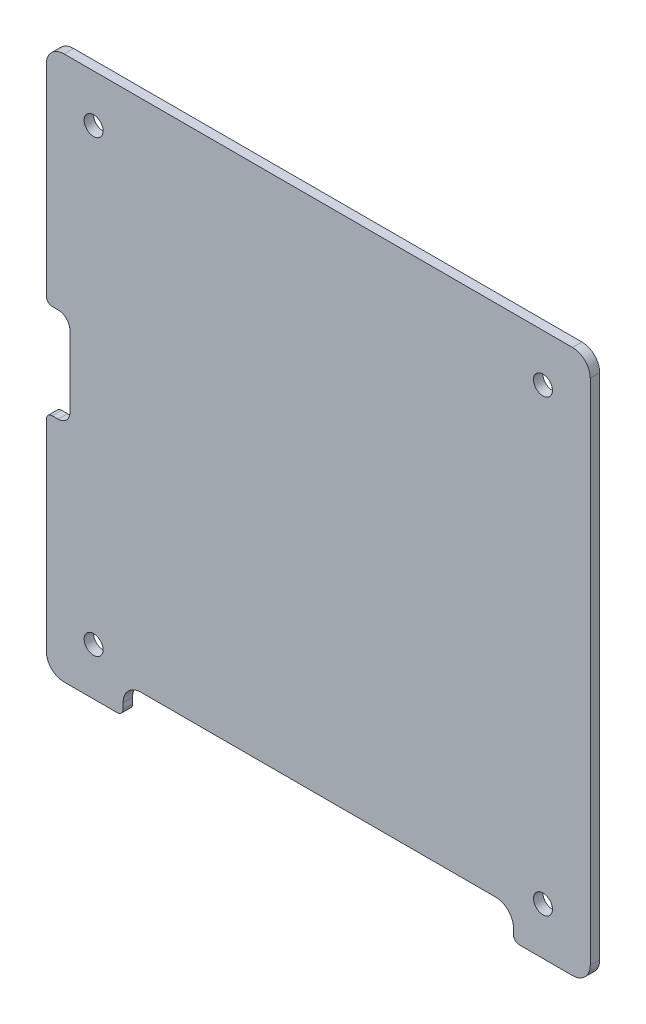
ISO-10303-21;
HEADER;
FILE_DESCRIPTION(('STEP AP214'),'2;1');
FILE_NAME('part.step','',(''),(''),'','','');
FILE_SCHEMA(('AUTOMOTIVE_DESIGN { 1 0 10303 214 1 1 1 1 }'));
ENDSEC;
DATA;
#1=APPLICATION_CONTEXT('core data for automotive mechanical design processes');
#2=APPLICATION_PROTOCOL_DEFINITION('international standard','automotive_design',2000,#1);
#3=PRODUCT_CONTEXT('',#1,'mechanical');
#4=PRODUCT('Part','Part','',(#3));
#5=PRODUCT_RELATED_PRODUCT_CATEGORY('part','',(#4));
#6=PRODUCT_DEFINITION_FORMATION('','',#4);
#7=PRODUCT_DEFINITION_CONTEXT('part definition',#1,'design');
#8=PRODUCT_DEFINITION('design','',#6,#7);
#9=PRODUCT_DEFINITION_SHAPE('','',#8);
#10=(LENGTH_UNIT() NAMED_UNIT(*) SI_UNIT(.MILLI.,.METRE.));
#11=(NAMED_UNIT(*) PLANE_ANGLE_UNIT() SI_UNIT($,.RADIAN.));
#12=(NAMED_UNIT(*) SI_UNIT($,.STERADIAN.) SOLID_ANGLE_UNIT());
#13=UNCERTAINTY_MEASURE_WITH_UNIT(LENGTH_MEASURE(1.E-05),#10,'distance_accuracy_value','');
#14=(GEOMETRIC_REPRESENTATION_CONTEXT(3) GLOBAL_UNCERTAINTY_ASSIGNED_CONTEXT((#13)) GLOBAL_UNIT_ASSIGNED_CONTEXT((#10,
#11,#12)) REPRESENTATION_CONTEXT('',''));
#15=CARTESIAN_POINT('',(0.,0.,0.));
#16=DIRECTION('',(0.,0.,1.));
#17=DIRECTION('',(1.,0.,0.));
#18=AXIS2_PLACEMENT_3D('',#15,#16,#17);
#19=CARTESIAN_POINT('',(6.50000000000001,92.75,-1.6));
#20=DIRECTION('',(1.,0.,0.));
#21=DIRECTION('',(0.,1.,0.));
#22=AXIS2_PLACEMENT_3D('',#19,#20,#21);
#23=PLANE('',#22);
#24=DIRECTION('',(0.,1.,0.));
#25=VECTOR('',#24,1.);
#26=CARTESIAN_POINT('',(6.50000000000001,92.75,0.));
#27=LINE('',#26,#25);
#28=CARTESIAN_POINT('',(6.49999999999999,3.75,0.));
#29=VERTEX_POINT('',#28);
#30=CARTESIAN_POINT('',(6.50000000000001,89.75,0.));
#31=VERTEX_POINT('',#30);
#32=EDGE_CURVE('E362',#29,#31,#27,.T.);
#33=ORIENTED_EDGE('',*,*,#32,.F.);
#34=DIRECTION('',(0.,0.,1.));
#35=VECTOR('',#34,1.);
#36=CARTESIAN_POINT('',(6.49999999999999,3.75,-1.6));
#37=LINE('',#36,#35);
#38=CARTESIAN_POINT('',(6.49999999999999,3.75,-1.6));
#39=VERTEX_POINT('',#38);
#40=EDGE_CURVE('E247',#29,#39,#37,.F.);
#41=ORIENTED_EDGE('',*,*,#40,.T.);
#42=DIRECTION('',(0.,1.,0.));
#43=VECTOR('',#42,1.);
#44=CARTESIAN_POINT('',(6.50000000000001,92.75,-1.6));
#45=LINE('',#44,#43);
#46=CARTESIAN_POINT('',(6.50000000000001,89.75,-1.6));
#47=VERTEX_POINT('',#46);
#48=EDGE_CURVE('E381',#39,#47,#45,.T.);
#49=ORIENTED_EDGE('',*,*,#48,.T.);
#50=DIRECTION('',(0.,0.,1.));
#51=VECTOR('',#50,1.);
#52=CARTESIAN_POINT('',(6.50000000000001,89.75,-1.6));
#53=LINE('',#52,#51);
#54=EDGE_CURVE('E244',#47,#31,#53,.T.);
#55=ORIENTED_EDGE('',*,*,#54,.T.);
#56=EDGE_LOOP('',(#33,#41,#49,#55));
#57=FACE_BOUND('',#56,.T.);
#58=ADVANCED_FACE('F32',(#57),#23,.T.);
#59=CARTESIAN_POINT('',(6.49999999999999,0.750000000000002,-1.6));
#60=DIRECTION('',(0.,-1.,0.));
#61=DIRECTION('',(1.,0.,0.));
#62=AXIS2_PLACEMENT_3D('',#59,#60,#61);
#63=PLANE('',#62);
#64=DIRECTION('',(1.,0.,0.));
#65=VECTOR('',#64,1.);
#66=CARTESIAN_POINT('',(6.49999999999999,0.750000000000002,0.));
#67=LINE('',#66,#65);
#68=CARTESIAN_POINT('',(-5.50000000000001,0.750000000000011,0.));
#69=VERTEX_POINT('',#68);
#70=CARTESIAN_POINT('',(3.49999999999999,0.750000000000005,0.));
#71=VERTEX_POINT('',#70);
#72=EDGE_CURVE('E227',#69,#71,#67,.T.);
#73=ORIENTED_EDGE('',*,*,#72,.F.);
#74=DIRECTION('',(0.,0.,1.));
#75=VECTOR('',#74,1.);
#76=CARTESIAN_POINT('',(-5.50000000000001,0.750000000000011,-1.6));
#77=LINE('',#76,#75);
#78=CARTESIAN_POINT('',(-5.50000000000001,0.750000000000011,-1.6));
#79=VERTEX_POINT('',#78);
#80=EDGE_CURVE('E305',#69,#79,#77,.F.);
#81=ORIENTED_EDGE('',*,*,#80,.T.);
#82=DIRECTION('',(1.,0.,0.));
#83=VECTOR('',#82,1.);
#84=CARTESIAN_POINT('',(6.49999999999999,0.750000000000002,-1.6));
#85=LINE('',#84,#83);
#86=CARTESIAN_POINT('',(3.49999999999999,0.750000000000005,-1.6));
#87=VERTEX_POINT('',#86);
#88=EDGE_CURVE('E220',#79,#87,#85,.T.);
#89=ORIENTED_EDGE('',*,*,#88,.T.);
#90=DIRECTION('',(0.,0.,1.));
#91=VECTOR('',#90,1.);
#92=CARTESIAN_POINT('',(3.49999999999999,0.750000000000005,-1.6));
#93=LINE('',#92,#91);
#94=EDGE_CURVE('E233',#87,#71,#93,.T.);
#95=ORIENTED_EDGE('',*,*,#94,.T.);
#96=EDGE_LOOP('',(#73,#81,#89,#95));
#97=FACE_BOUND('',#96,.T.);
#98=ADVANCED_FACE('F476',(#97),#63,.T.);
#99=CARTESIAN_POINT('',(-6.49999999999999,5.75,-1.6));
#100=DIRECTION('',(-1.,0.,0.));
#101=DIRECTION('',(0.,-1.,0.));
#102=AXIS2_PLACEMENT_3D('',#99,#100,#101);
#103=PLANE('',#102);
#104=DIRECTION('',(0.,-1.,0.));
#105=VECTOR('',#104,1.);
#106=CARTESIAN_POINT('',(-6.49999999999999,5.75,-1.6));
#107=LINE('',#106,#105);
#108=CARTESIAN_POINT('',(-6.50000000000001,2.74999999999998,-1.6));
#109=VERTEX_POINT('',#108);
#110=CARTESIAN_POINT('',(-6.50000000000001,1.75000000000002,-1.6));
#111=VERTEX_POINT('',#110);
#112=EDGE_CURVE('E224',#109,#111,#107,.T.);
#113=ORIENTED_EDGE('',*,*,#112,.T.);
#114=DIRECTION('',(0.,0.,1.));
#115=VECTOR('',#114,1.);
#116=CARTESIAN_POINT('',(-6.50000000000001,1.75000000000002,-1.6));
#117=LINE('',#116,#115);
#118=CARTESIAN_POINT('',(-6.50000000000001,1.75000000000002,0.));
#119=VERTEX_POINT('',#118);
#120=EDGE_CURVE('E302',#111,#119,#117,.T.);
#121=ORIENTED_EDGE('',*,*,#120,.T.);
#122=DIRECTION('',(0.,-1.,0.));
#123=VECTOR('',#122,1.);
#124=CARTESIAN_POINT('',(-6.49999999999999,5.75,0.));
#125=LINE('',#124,#123);
#126=CARTESIAN_POINT('',(-6.50000000000001,2.74999999999998,0.));
#127=VERTEX_POINT('',#126);
#128=EDGE_CURVE('E215',#127,#119,#125,.T.);
#129=ORIENTED_EDGE('',*,*,#128,.F.);
#130=DIRECTION('',(0.,0.,1.));
#131=VECTOR('',#130,1.);
#132=CARTESIAN_POINT('',(-6.50000000000001,2.74999999999998,-1.6));
#133=LINE('',#132,#131);
#134=EDGE_CURVE('E222',#127,#109,#133,.F.);
#135=ORIENTED_EDGE('',*,*,#134,.T.);
#136=EDGE_LOOP('',(#113,#121,#129,#135));
#137=FACE_BOUND('',#136,.T.);
#138=ADVANCED_FACE('F469',(#137),#103,.T.);
#139=CARTESIAN_POINT('',(-72.5,5.75,-1.6));
#140=DIRECTION('',(0.,-1.,0.));
#141=DIRECTION('',(0.,0.,-1.));
#142=AXIS2_PLACEMENT_3D('',#139,#140,#141);
#143=PLANE('',#142);
#144=DIRECTION('',(1.,0.,0.));
#145=VECTOR('',#144,1.);
#146=CARTESIAN_POINT('',(-72.5,5.75,-1.6));
#147=LINE('',#146,#145);
#148=CARTESIAN_POINT('',(-69.5,5.75,-1.6));
#149=VERTEX_POINT('',#148);
#150=CARTESIAN_POINT('',(-9.50000000000001,5.75,-1.6));
#151=VERTEX_POINT('',#150);
#152=EDGE_CURVE('E358',#149,#151,#147,.T.);
#153=ORIENTED_EDGE('',*,*,#152,.T.);
#154=DIRECTION('',(0.,0.,1.));
#155=VECTOR('',#154,1.);
#156=CARTESIAN_POINT('',(-9.50000000000001,5.75,0.));
#157=LINE('',#156,#155);
#158=CARTESIAN_POINT('',(-9.50000000000001,5.75,0.));
#159=VERTEX_POINT('',#158);
#160=EDGE_CURVE('E214',#151,#159,#157,.T.);
#161=ORIENTED_EDGE('',*,*,#160,.T.);
#162=DIRECTION('',(1.,0.,0.));
#163=VECTOR('',#162,1.);
#164=CARTESIAN_POINT('',(-72.5,5.75,0.));
#165=LINE('',#164,#163);
#166=CARTESIAN_POINT('',(-69.5,5.75,0.));
#167=VERTEX_POINT('',#166);
#168=EDGE_CURVE('E197',#167,#159,#165,.T.);
#169=ORIENTED_EDGE('',*,*,#168,.F.);
#170=DIRECTION('',(0.,0.,1.));
#171=VECTOR('',#170,1.);
#172=CARTESIAN_POINT('',(-69.5,5.75,-1.6));
#173=LINE('',#172,#171);
#174=EDGE_CURVE('E211',#167,#149,#173,.F.);
#175=ORIENTED_EDGE('',*,*,#174,.T.);
#176=EDGE_LOOP('',(#153,#161,#169,#175));
#177=FACE_BOUND('',#176,.T.);
#178=ADVANCED_FACE('F210',(#177),#143,.T.);
#179=CARTESIAN_POINT('',(-72.5,0.750000000000004,-1.6));
#180=DIRECTION('',(1.,0.,0.));
#181=DIRECTION('',(0.,0.,-1.));
#182=AXIS2_PLACEMENT_3D('',#179,#180,#181);
#183=PLANE('',#182);
#184=DIRECTION('',(0.,1.,0.));
#185=VECTOR('',#184,1.);
#186=CARTESIAN_POINT('',(-72.5,0.750000000000004,0.));
#187=LINE('',#186,#185);
#188=CARTESIAN_POINT('',(-72.5,1.75,0.));
#189=VERTEX_POINT('',#188);
#190=CARTESIAN_POINT('',(-72.5,2.75,0.));
#191=VERTEX_POINT('',#190);
#192=EDGE_CURVE('E199',#189,#191,#187,.T.);
#193=ORIENTED_EDGE('',*,*,#192,.F.);
#194=DIRECTION('',(0.,0.,1.));
#195=VECTOR('',#194,1.);
#196=CARTESIAN_POINT('',(-72.5,1.75,-1.6));
#197=LINE('',#196,#195);
#198=CARTESIAN_POINT('',(-72.5,1.75,-1.6));
#199=VERTEX_POINT('',#198);
#200=EDGE_CURVE('E310',#189,#199,#197,.F.);
#201=ORIENTED_EDGE('',*,*,#200,.T.);
#202=DIRECTION('',(0.,1.,0.));
#203=VECTOR('',#202,1.);
#204=CARTESIAN_POINT('',(-72.5,0.750000000000004,-1.6));
#205=LINE('',#204,#203);
#206=CARTESIAN_POINT('',(-72.5,2.75,-1.6));
#207=VERTEX_POINT('',#206);
#208=EDGE_CURVE('E356',#199,#207,#205,.T.);
#209=ORIENTED_EDGE('',*,*,#208,.T.);
#210=DIRECTION('',(0.,0.,1.));
#211=VECTOR('',#210,1.);
#212=CARTESIAN_POINT('',(-72.5,2.75,0.));
#213=LINE('',#212,#211);
#214=EDGE_CURVE('E231',#207,#191,#213,.T.);
#215=ORIENTED_EDGE('',*,*,#214,.T.);
#216=EDGE_LOOP('',(#193,#201,#209,#215));
#217=FACE_BOUND('',#216,.T.);
#218=ADVANCED_FACE('F461',(#217),#183,.T.);
#219=CARTESIAN_POINT('',(-72.5,0.750000000000004,-1.6));
#220=DIRECTION('',(0.,-1.,0.));
#221=DIRECTION('',(1.,0.,0.));
#222=AXIS2_PLACEMENT_3D('',#219,#220,#221);
#223=PLANE('',#222);
#224=DIRECTION('',(1.,0.,0.));
#225=VECTOR('',#224,1.);
#226=CARTESIAN_POINT('',(-72.5,0.750000000000004,-1.6));
#227=LINE('',#226,#225);
#228=CARTESIAN_POINT('',(-82.5,0.750000000000003,-1.6));
#229=VERTEX_POINT('',#228);
#230=CARTESIAN_POINT('',(-73.5,0.750000000000004,-1.6));
#231=VERTEX_POINT('',#230);
#232=EDGE_CURVE('E353',#229,#231,#227,.T.);
#233=ORIENTED_EDGE('',*,*,#232,.T.);
#234=DIRECTION('',(0.,0.,1.));
#235=VECTOR('',#234,1.);
#236=CARTESIAN_POINT('',(-73.5,0.750000000000004,-1.6));
#237=LINE('',#236,#235);
#238=CARTESIAN_POINT('',(-73.5,0.750000000000004,0.));
#239=VERTEX_POINT('',#238);
#240=EDGE_CURVE('E307',#231,#239,#237,.T.);
#241=ORIENTED_EDGE('',*,*,#240,.T.);
#242=DIRECTION('',(1.,0.,0.));
#243=VECTOR('',#242,1.);
#244=CARTESIAN_POINT('',(-72.5,0.750000000000004,0.));
#245=LINE('',#244,#243);
#246=CARTESIAN_POINT('',(-82.5,0.750000000000003,0.));
#247=VERTEX_POINT('',#246);
#248=EDGE_CURVE('E376',#247,#239,#245,.T.);
#249=ORIENTED_EDGE('',*,*,#248,.F.);
#250=DIRECTION('',(0.,0.,1.));
#251=VECTOR('',#250,1.);
#252=CARTESIAN_POINT('',(-82.5,0.750000000000003,-1.6));
#253=LINE('',#252,#251);
#254=EDGE_CURVE('E262',#247,#229,#253,.F.);
#255=ORIENTED_EDGE('',*,*,#254,.T.);
#256=EDGE_LOOP('',(#233,#241,#249,#255));
#257=FACE_BOUND('',#256,.T.);
#258=ADVANCED_FACE('F454',(#257),#223,.T.);
#259=CARTESIAN_POINT('',(-85.5,38.75,-1.6));
#260=DIRECTION('',(-1.,0.,0.));
#261=DIRECTION('',(0.,0.,1.));
#262=AXIS2_PLACEMENT_3D('',#259,#260,#261);
#263=PLANE('',#262);
#264=DIRECTION('',(0.,-1.,0.));
#265=VECTOR('',#264,1.);
#266=CARTESIAN_POINT('',(-85.5,38.75,0.));
#267=LINE('',#266,#265);
#268=CARTESIAN_POINT('',(-85.5,37.75,0.));
#269=VERTEX_POINT('',#268);
#270=CARTESIAN_POINT('',(-85.5,3.75,0.));
#271=VERTEX_POINT('',#270);
#272=EDGE_CURVE('E374',#269,#271,#267,.T.);
#273=ORIENTED_EDGE('',*,*,#272,.F.);
#274=DIRECTION('',(0.,0.,1.));
#275=VECTOR('',#274,1.);
#276=CARTESIAN_POINT('',(-85.5,37.75,-1.6));
#277=LINE('',#276,#275);
#278=CARTESIAN_POINT('',(-85.5,37.75,-1.6));
#279=VERTEX_POINT('',#278);
#280=EDGE_CURVE('E286',#269,#279,#277,.F.);
#281=ORIENTED_EDGE('',*,*,#280,.T.);
#282=DIRECTION('',(0.,-1.,0.));
#283=VECTOR('',#282,1.);
#284=CARTESIAN_POINT('',(-85.5,38.75,-1.6));
#285=LINE('',#284,#283);
#286=CARTESIAN_POINT('',(-85.5,3.75,-1.6));
#287=VERTEX_POINT('',#286);
#288=EDGE_CURVE('E351',#279,#287,#285,.T.);
#289=ORIENTED_EDGE('',*,*,#288,.T.);
#290=DIRECTION('',(0.,0.,1.));
#291=VECTOR('',#290,1.);
#292=CARTESIAN_POINT('',(-85.5,3.75,-1.6));
#293=LINE('',#292,#291);
#294=EDGE_CURVE('E259',#287,#271,#293,.T.);
#295=ORIENTED_EDGE('',*,*,#294,.T.);
#296=EDGE_LOOP('',(#273,#281,#289,#295));
#297=FACE_BOUND('',#296,.T.);
#298=ADVANCED_FACE('F448',(#297),#263,.T.);
#299=CARTESIAN_POINT('',(-81.5,38.75,-1.6));
#300=DIRECTION('',(0.,1.,0.));
#301=DIRECTION('',(0.,0.,1.));
#302=AXIS2_PLACEMENT_3D('',#299,#300,#301);
#303=PLANE('',#302);
#304=DIRECTION('',(-1.,0.,0.));
#305=VECTOR('',#304,1.);
#306=CARTESIAN_POINT('',(-81.5,38.75,0.));
#307=LINE('',#306,#305);
#308=CARTESIAN_POINT('',(-83.5,38.75,0.));
#309=VERTEX_POINT('',#308);
#310=CARTESIAN_POINT('',(-84.5,38.75,0.));
#311=VERTEX_POINT('',#310);
#312=EDGE_CURVE('E333',#309,#311,#307,.T.);
#313=ORIENTED_EDGE('',*,*,#312,.F.);
#314=DIRECTION('',(0.,0.,1.));
#315=VECTOR('',#314,1.);
#316=CARTESIAN_POINT('',(-83.5,38.75,-1.6));
#317=LINE('',#316,#315);
#318=CARTESIAN_POINT('',(-83.5,38.75,-1.6));
#319=VERTEX_POINT('',#318);
#320=EDGE_CURVE('E317',#309,#319,#317,.F.);
#321=ORIENTED_EDGE('',*,*,#320,.T.);
#322=DIRECTION('',(-1.,0.,0.));
#323=VECTOR('',#322,1.);
#324=CARTESIAN_POINT('',(-81.5,38.75,-1.6));
#325=LINE('',#324,#323);
#326=CARTESIAN_POINT('',(-84.5,38.75,-1.6));
#327=VERTEX_POINT('',#326);
#328=EDGE_CURVE('E343',#319,#327,#325,.T.);
#329=ORIENTED_EDGE('',*,*,#328,.T.);
#330=DIRECTION('',(0.,0.,1.));
#331=VECTOR('',#330,1.);
#332=CARTESIAN_POINT('',(-84.5,38.75,-1.6));
#333=LINE('',#332,#331);
#334=EDGE_CURVE('E275',#327,#311,#333,.T.);
#335=ORIENTED_EDGE('',*,*,#334,.T.);
#336=EDGE_LOOP('',(#313,#321,#329,#335));
#337=FACE_BOUND('',#336,.T.);
#338=ADVANCED_FACE('F441',(#337),#303,.T.);
#339=CARTESIAN_POINT('',(-81.5,54.75,-1.6));
#340=DIRECTION('',(-1.,0.,0.));
#341=DIRECTION('',(0.,-1.,0.));
#342=AXIS2_PLACEMENT_3D('',#339,#340,#341);
#343=PLANE('',#342);
#344=DIRECTION('',(0.,-1.,0.));
#345=VECTOR('',#344,1.);
#346=CARTESIAN_POINT('',(-81.5,54.75,-1.6));
#347=LINE('',#346,#345);
#348=CARTESIAN_POINT('',(-81.5,52.75,-1.6));
#349=VERTEX_POINT('',#348);
#350=CARTESIAN_POINT('',(-81.5,40.75,-1.6));
#351=VERTEX_POINT('',#350);
#352=EDGE_CURVE('E340',#349,#351,#347,.T.);
#353=ORIENTED_EDGE('',*,*,#352,.T.);
#354=DIRECTION('',(0.,0.,1.));
#355=VECTOR('',#354,1.);
#356=CARTESIAN_POINT('',(-81.5,40.75,0.));
#357=LINE('',#356,#355);
#358=CARTESIAN_POINT('',(-81.5,40.75,0.));
#359=VERTEX_POINT('',#358);
#360=EDGE_CURVE('E314',#351,#359,#357,.T.);
#361=ORIENTED_EDGE('',*,*,#360,.T.);
#362=DIRECTION('',(0.,-1.,0.));
#363=VECTOR('',#362,1.);
#364=CARTESIAN_POINT('',(-81.5,54.75,0.));
#365=LINE('',#364,#363);
#366=CARTESIAN_POINT('',(-81.5,52.75,0.));
#367=VERTEX_POINT('',#366);
#368=EDGE_CURVE('E326',#367,#359,#365,.T.);
#369=ORIENTED_EDGE('',*,*,#368,.F.);
#370=DIRECTION('',(0.,0.,1.));
#371=VECTOR('',#370,1.);
#372=CARTESIAN_POINT('',(-81.5,52.75,-1.6));
#373=LINE('',#372,#371);
#374=EDGE_CURVE('E312',#367,#349,#373,.F.);
#375=ORIENTED_EDGE('',*,*,#374,.T.);
#376=EDGE_LOOP('',(#353,#361,#369,#375));
#377=FACE_BOUND('',#376,.T.);
#378=ADVANCED_FACE('F331',(#377),#343,.T.);
#379=CARTESIAN_POINT('',(-85.5,54.75,-1.6));
#380=DIRECTION('',(0.,-1.,0.));
#381=DIRECTION('',(0.,0.,-1.));
#382=AXIS2_PLACEMENT_3D('',#379,#380,#381);
#383=PLANE('',#382);
#384=DIRECTION('',(1.,0.,0.));
#385=VECTOR('',#384,1.);
#386=CARTESIAN_POINT('',(-85.5,54.75,-1.6));
#387=LINE('',#386,#385);
#388=CARTESIAN_POINT('',(-84.5,54.75,-1.6));
#389=VERTEX_POINT('',#388);
#390=CARTESIAN_POINT('',(-83.5,54.75,-1.6));
#391=VERTEX_POINT('',#390);
#392=EDGE_CURVE('E338',#389,#391,#387,.T.);
#393=ORIENTED_EDGE('',*,*,#392,.T.);
#394=DIRECTION('',(0.,0.,1.));
#395=VECTOR('',#394,1.);
#396=CARTESIAN_POINT('',(-83.5,54.75,0.));
#397=LINE('',#396,#395);
#398=CARTESIAN_POINT('',(-83.5,54.75,0.));
#399=VERTEX_POINT('',#398);
#400=EDGE_CURVE('E319',#391,#399,#397,.T.);
#401=ORIENTED_EDGE('',*,*,#400,.T.);
#402=DIRECTION('',(1.,0.,0.));
#403=VECTOR('',#402,1.);
#404=CARTESIAN_POINT('',(-85.5,54.75,0.));
#405=LINE('',#404,#403);
#406=CARTESIAN_POINT('',(-84.5,54.75,0.));
#407=VERTEX_POINT('',#406);
#408=EDGE_CURVE('E328',#407,#399,#405,.T.);
#409=ORIENTED_EDGE('',*,*,#408,.F.);
#410=DIRECTION('',(0.,0.,1.));
#411=VECTOR('',#410,1.);
#412=CARTESIAN_POINT('',(-84.5,54.75,-1.6));
#413=LINE('',#412,#411);
#414=EDGE_CURVE('E300',#407,#389,#413,.F.);
#415=ORIENTED_EDGE('',*,*,#414,.T.);
#416=EDGE_LOOP('',(#393,#401,#409,#415));
#417=FACE_BOUND('',#416,.T.);
#418=ADVANCED_FACE('F336',(#417),#383,.T.);
#419=CARTESIAN_POINT('',(-85.5,92.75,-1.6));
#420=DIRECTION('',(-1.,0.,0.));
#421=DIRECTION('',(0.,0.,1.));
#422=AXIS2_PLACEMENT_3D('',#419,#420,#421);
#423=PLANE('',#422);
#424=DIRECTION('',(0.,-1.,0.));
#425=VECTOR('',#424,1.);
#426=CARTESIAN_POINT('',(-85.5,92.75,-1.6));
#427=LINE('',#426,#425);
#428=CARTESIAN_POINT('',(-85.5,89.75,-1.6));
#429=VERTEX_POINT('',#428);
#430=CARTESIAN_POINT('',(-85.5,55.75,-1.6));
#431=VERTEX_POINT('',#430);
#432=EDGE_CURVE('E341',#429,#431,#427,.T.);
#433=ORIENTED_EDGE('',*,*,#432,.T.);
#434=DIRECTION('',(0.,0.,1.));
#435=VECTOR('',#434,1.);
#436=CARTESIAN_POINT('',(-85.5,55.75,-1.6));
#437=LINE('',#436,#435);
#438=CARTESIAN_POINT('',(-85.5,55.75,0.));
#439=VERTEX_POINT('',#438);
#440=EDGE_CURVE('E297',#431,#439,#437,.T.);
#441=ORIENTED_EDGE('',*,*,#440,.T.);
#442=DIRECTION('',(0.,-1.,0.));
#443=VECTOR('',#442,1.);
#444=CARTESIAN_POINT('',(-85.5,92.75,0.));
#445=LINE('',#444,#443);
#446=CARTESIAN_POINT('',(-85.5,89.75,0.));
#447=VERTEX_POINT('',#446);
#448=EDGE_CURVE('E369',#447,#439,#445,.T.);
#449=ORIENTED_EDGE('',*,*,#448,.F.);
#450=DIRECTION('',(0.,0.,1.));
#451=VECTOR('',#450,1.);
#452=CARTESIAN_POINT('',(-85.5,89.75,-1.6));
#453=LINE('',#452,#451);
#454=EDGE_CURVE('E269',#447,#429,#453,.F.);
#455=ORIENTED_EDGE('',*,*,#454,.T.);
#456=EDGE_LOOP('',(#433,#441,#449,#455));
#457=FACE_BOUND('',#456,.T.);
#458=ADVANCED_FACE('F498',(#457),#423,.T.);
#459=CARTESIAN_POINT('',(6.50000000000001,92.75,-1.6));
#460=DIRECTION('',(0.,1.,0.));
#461=DIRECTION('',(0.,0.,1.));
#462=AXIS2_PLACEMENT_3D('',#459,#460,#461);
#463=PLANE('',#462);
#464=DIRECTION('',(-1.,0.,0.));
#465=VECTOR('',#464,1.);
#466=CARTESIAN_POINT('',(6.50000000000001,92.75,-1.6));
#467=LINE('',#466,#465);
#468=CARTESIAN_POINT('',(3.50000000000001,92.75,-1.6));
#469=VERTEX_POINT('',#468);
#470=CARTESIAN_POINT('',(-82.5,92.75,-1.6));
#471=VERTEX_POINT('',#470);
#472=EDGE_CURVE('E346',#469,#471,#467,.T.);
#473=ORIENTED_EDGE('',*,*,#472,.T.);
#474=DIRECTION('',(0.,0.,1.));
#475=VECTOR('',#474,1.);
#476=CARTESIAN_POINT('',(-82.5,92.75,-1.6));
#477=LINE('',#476,#475);
#478=CARTESIAN_POINT('',(-82.5,92.75,0.));
#479=VERTEX_POINT('',#478);
#480=EDGE_CURVE('E266',#471,#479,#477,.T.);
#481=ORIENTED_EDGE('',*,*,#480,.T.);
#482=DIRECTION('',(-1.,0.,0.));
#483=VECTOR('',#482,1.);
#484=CARTESIAN_POINT('',(6.50000000000001,92.75,0.));
#485=LINE('',#484,#483);
#486=CARTESIAN_POINT('',(3.50000000000001,92.75,0.));
#487=VERTEX_POINT('',#486);
#488=EDGE_CURVE('E365',#487,#479,#485,.T.);
#489=ORIENTED_EDGE('',*,*,#488,.F.);
#490=DIRECTION('',(0.,0.,1.));
#491=VECTOR('',#490,1.);
#492=CARTESIAN_POINT('',(3.50000000000001,92.75,-1.6));
#493=LINE('',#492,#491);
#494=EDGE_CURVE('E264',#487,#469,#493,.F.);
#495=ORIENTED_EDGE('',*,*,#494,.T.);
#496=EDGE_LOOP('',(#473,#481,#489,#495));
#497=FACE_BOUND('',#496,.T.);
#498=ADVANCED_FACE('F420',(#497),#463,.T.);
#499=CARTESIAN_POINT('',(6.49999999999999,0.750000000000002,-1.6));
#500=DIRECTION('',(0.,0.,-1.));
#501=DIRECTION('',(-1.,0.,0.));
#502=AXIS2_PLACEMENT_3D('',#499,#500,#501);
#503=PLANE('',#502);
#504=CARTESIAN_POINT('',(-1.49999999999996,84.75,-1.6));
#505=DIRECTION('',(0.,0.,-1.));
#506=DIRECTION('',(-1.,0.,0.));
#507=AXIS2_PLACEMENT_3D('',#504,#505,#506);
#508=CIRCLE('',#507,1.59999999999999);
#509=CARTESIAN_POINT('',(-3.09999999999995,84.75,-1.6));
#510=VERTEX_POINT('',#509);
#511=EDGE_CURVE('E411',#510,#510,#508,.T.);
#512=ORIENTED_EDGE('',*,*,#511,.F.);
#513=EDGE_LOOP('',(#512));
#514=FACE_BOUND('',#513,.T.);
#515=CARTESIAN_POINT('',(-1.49999999999998,8.74999999999998,-1.6));
#516=DIRECTION('',(0.,0.,-1.));
#517=DIRECTION('',(-1.,0.,0.));
#518=AXIS2_PLACEMENT_3D('',#515,#516,#517);
#519=CIRCLE('',#518,1.59999999999999);
#520=CARTESIAN_POINT('',(-3.09999999999997,8.74999999999998,-1.6));
#521=VERTEX_POINT('',#520);
#522=EDGE_CURVE('E405',#521,#521,#519,.T.);
#523=ORIENTED_EDGE('',*,*,#522,.F.);
#524=EDGE_LOOP('',(#523));
#525=FACE_BOUND('',#524,.T.);
#526=CARTESIAN_POINT('',(-77.5,8.75000000000002,-1.6));
#527=DIRECTION('',(0.,0.,-1.));
#528=DIRECTION('',(-1.,0.,0.));
#529=AXIS2_PLACEMENT_3D('',#526,#527,#528);
#530=CIRCLE('',#529,1.59999999999999);
#531=CARTESIAN_POINT('',(-79.1,8.75000000000002,-1.6));
#532=VERTEX_POINT('',#531);
#533=EDGE_CURVE('E399',#532,#532,#530,.T.);
#534=ORIENTED_EDGE('',*,*,#533,.F.);
#535=EDGE_LOOP('',(#534));
#536=FACE_BOUND('',#535,.T.);
#537=CARTESIAN_POINT('',(-77.5,84.7500000000001,-1.6));
#538=DIRECTION('',(0.,0.,-1.));
#539=DIRECTION('',(-1.,0.,0.));
#540=AXIS2_PLACEMENT_3D('',#537,#538,#539);
#541=CIRCLE('',#540,1.59999999999999);
#542=CARTESIAN_POINT('',(-79.1,84.7500000000001,-1.6));
#543=VERTEX_POINT('',#542);
#544=EDGE_CURVE('E393',#543,#543,#541,.T.);
#545=ORIENTED_EDGE('',*,*,#544,.F.);
#546=EDGE_LOOP('',(#545));
#547=FACE_BOUND('',#546,.T.);
#548=ORIENTED_EDGE('',*,*,#288,.F.);
#549=CARTESIAN_POINT('',(-84.5,37.75,-1.6));
#550=DIRECTION('',(0.,0.,-1.));
#551=DIRECTION('',(-1.,0.,0.));
#552=AXIS2_PLACEMENT_3D('',#549,#550,#551);
#553=CIRCLE('',#552,1.);
#554=EDGE_CURVE('E294',#279,#327,#553,.T.);
#555=ORIENTED_EDGE('',*,*,#554,.T.);
#556=ORIENTED_EDGE('',*,*,#328,.F.);
#557=CARTESIAN_POINT('',(-83.5,40.75,-1.6));
#558=DIRECTION('',(0.,0.,-1.));
#559=DIRECTION('',(-1.,0.,0.));
#560=AXIS2_PLACEMENT_3D('',#557,#558,#559);
#561=CIRCLE('',#560,2.);
#562=EDGE_CURVE('E323',#319,#351,#561,.F.);
#563=ORIENTED_EDGE('',*,*,#562,.T.);
#564=ORIENTED_EDGE('',*,*,#352,.F.);
#565=CARTESIAN_POINT('',(-83.5,52.75,-1.6));
#566=DIRECTION('',(0.,0.,-1.));
#567=DIRECTION('',(-1.,0.,0.));
#568=AXIS2_PLACEMENT_3D('',#565,#566,#567);
#569=CIRCLE('',#568,2.);
#570=EDGE_CURVE('E11',#349,#391,#569,.F.);
#571=ORIENTED_EDGE('',*,*,#570,.T.);
#572=ORIENTED_EDGE('',*,*,#392,.F.);
#573=CARTESIAN_POINT('',(-84.5,55.75,-1.6));
#574=DIRECTION('',(0.,0.,-1.));
#575=DIRECTION('',(-1.,0.,0.));
#576=AXIS2_PLACEMENT_3D('',#573,#574,#575);
#577=CIRCLE('',#576,1.);
#578=EDGE_CURVE('E292',#389,#431,#577,.T.);
#579=ORIENTED_EDGE('',*,*,#578,.T.);
#580=ORIENTED_EDGE('',*,*,#432,.F.);
#581=CARTESIAN_POINT('',(-82.5,89.75,-1.6));
#582=DIRECTION('',(0.,0.,-1.));
#583=DIRECTION('',(-1.,0.,0.));
#584=AXIS2_PLACEMENT_3D('',#581,#582,#583);
#585=CIRCLE('',#584,3.);
#586=EDGE_CURVE('E251',#429,#471,#585,.T.);
#587=ORIENTED_EDGE('',*,*,#586,.T.);
#588=ORIENTED_EDGE('',*,*,#472,.F.);
#589=CARTESIAN_POINT('',(3.50000000000001,89.75,-1.6));
#590=DIRECTION('',(0.,0.,-1.));
#591=DIRECTION('',(-1.,0.,0.));
#592=AXIS2_PLACEMENT_3D('',#589,#590,#591);
#593=CIRCLE('',#592,3.);
#594=EDGE_CURVE('E249',#469,#47,#593,.T.);
#595=ORIENTED_EDGE('',*,*,#594,.T.);
#596=ORIENTED_EDGE('',*,*,#48,.F.);
#597=CARTESIAN_POINT('',(3.49999999999999,3.75,-1.6));
#598=DIRECTION('',(0.,0.,-1.));
#599=DIRECTION('',(-1.,0.,0.));
#600=AXIS2_PLACEMENT_3D('',#597,#598,#599);
#601=CIRCLE('',#600,3.);
#602=EDGE_CURVE('E256',#39,#87,#601,.T.);
#603=ORIENTED_EDGE('',*,*,#602,.T.);
#604=ORIENTED_EDGE('',*,*,#88,.F.);
#605=CARTESIAN_POINT('',(-5.50000000000001,1.75000000000001,-1.6));
#606=DIRECTION('',(0.,0.,-1.));
#607=DIRECTION('',(-1.,0.,0.));
#608=AXIS2_PLACEMENT_3D('',#605,#606,#607);
#609=CIRCLE('',#608,1.);
#610=EDGE_CURVE('E290',#79,#111,#609,.T.);
#611=ORIENTED_EDGE('',*,*,#610,.T.);
#612=ORIENTED_EDGE('',*,*,#112,.F.);
#613=CARTESIAN_POINT('',(-9.50000000000001,2.75,-1.6));
#614=DIRECTION('',(0.,0.,-1.));
#615=DIRECTION('',(-1.,0.,0.));
#616=AXIS2_PLACEMENT_3D('',#613,#614,#615);
#617=CIRCLE('',#616,3.);
#618=EDGE_CURVE('E205',#109,#151,#617,.F.);
#619=ORIENTED_EDGE('',*,*,#618,.T.);
#620=ORIENTED_EDGE('',*,*,#152,.F.);
#621=CARTESIAN_POINT('',(-69.5,2.75,-1.6));
#622=DIRECTION('',(0.,0.,-1.));
#623=DIRECTION('',(-1.,0.,0.));
#624=AXIS2_PLACEMENT_3D('',#621,#622,#623);
#625=CIRCLE('',#624,3.);
#626=EDGE_CURVE('E204',#149,#207,#625,.F.);
#627=ORIENTED_EDGE('',*,*,#626,.T.);
#628=ORIENTED_EDGE('',*,*,#208,.F.);
#629=CARTESIAN_POINT('',(-73.5,1.75,-1.6));
#630=DIRECTION('',(0.,0.,-1.));
#631=DIRECTION('',(-1.,0.,0.));
#632=AXIS2_PLACEMENT_3D('',#629,#630,#631);
#633=CIRCLE('',#632,1.);
#634=EDGE_CURVE('E288',#199,#231,#633,.T.);
#635=ORIENTED_EDGE('',*,*,#634,.T.);
#636=ORIENTED_EDGE('',*,*,#232,.F.);
#637=CARTESIAN_POINT('',(-82.5,3.75,-1.6));
#638=DIRECTION('',(0.,0.,-1.));
#639=DIRECTION('',(-1.,0.,0.));
#640=AXIS2_PLACEMENT_3D('',#637,#638,#639);
#641=CIRCLE('',#640,3.);
#642=EDGE_CURVE('E253',#229,#287,#641,.T.);
#643=ORIENTED_EDGE('',*,*,#642,.T.);
#644=EDGE_LOOP('',(#548,#555,#556,#563,#564,#571,#572,#579,#580,#587,#588,#595,#596,#603,#604,
#611,#612,#619,#620,#627,#628,#635,#636,#643));
#645=FACE_BOUND('',#644,.T.);
#646=ADVANCED_FACE('F417',(#514,#525,#536,#547,#645),#503,.T.);
#647=CARTESIAN_POINT('',(6.49999999999999,0.750000000000002,0.));
#648=DIRECTION('',(0.,0.,-1.));
#649=DIRECTION('',(-1.,0.,0.));
#650=AXIS2_PLACEMENT_3D('',#647,#648,#649);
#651=PLANE('',#650);
#652=CARTESIAN_POINT('',(-1.49999999999996,84.75,0.));
#653=DIRECTION('',(0.,0.,-1.));
#654=DIRECTION('',(-1.,0.,0.));
#655=AXIS2_PLACEMENT_3D('',#652,#653,#654);
#656=CIRCLE('',#655,1.59999999999999);
#657=CARTESIAN_POINT('',(-3.09999999999995,84.75,0.));
#658=VERTEX_POINT('',#657);
#659=EDGE_CURVE('E408',#658,#658,#656,.T.);
#660=ORIENTED_EDGE('',*,*,#659,.T.);
#661=EDGE_LOOP('',(#660));
#662=FACE_BOUND('',#661,.T.);
#663=CARTESIAN_POINT('',(-1.49999999999998,8.74999999999998,0.));
#664=DIRECTION('',(0.,0.,-1.));
#665=DIRECTION('',(-1.,0.,0.));
#666=AXIS2_PLACEMENT_3D('',#663,#664,#665);
#667=CIRCLE('',#666,1.59999999999999);
#668=CARTESIAN_POINT('',(-3.09999999999998,8.74999999999998,0.));
#669=VERTEX_POINT('',#668);
#670=EDGE_CURVE('E402',#669,#669,#667,.T.);
#671=ORIENTED_EDGE('',*,*,#670,.T.);
#672=EDGE_LOOP('',(#671));
#673=FACE_BOUND('',#672,.T.);
#674=CARTESIAN_POINT('',(-77.5,8.75000000000002,0.));
#675=DIRECTION('',(0.,0.,-1.));
#676=DIRECTION('',(-1.,0.,0.));
#677=AXIS2_PLACEMENT_3D('',#674,#675,#676);
#678=CIRCLE('',#677,1.6);
#679=CARTESIAN_POINT('',(-79.1,8.75000000000002,0.));
#680=VERTEX_POINT('',#679);
#681=EDGE_CURVE('E396',#680,#680,#678,.T.);
#682=ORIENTED_EDGE('',*,*,#681,.T.);
#683=EDGE_LOOP('',(#682));
#684=FACE_BOUND('',#683,.T.);
#685=CARTESIAN_POINT('',(-77.5,84.7500000000001,0.));
#686=DIRECTION('',(0.,0.,-1.));
#687=DIRECTION('',(-1.,0.,0.));
#688=AXIS2_PLACEMENT_3D('',#685,#686,#687);
#689=CIRCLE('',#688,1.6);
#690=CARTESIAN_POINT('',(-79.1,84.7500000000001,0.));
#691=VERTEX_POINT('',#690);
#692=EDGE_CURVE('E366',#691,#691,#689,.T.);
#693=ORIENTED_EDGE('',*,*,#692,.T.);
#694=EDGE_LOOP('',(#693));
#695=FACE_BOUND('',#694,.T.);
#696=ORIENTED_EDGE('',*,*,#368,.T.);
#697=CARTESIAN_POINT('',(-83.5,40.75,0.));
#698=DIRECTION('',(0.,0.,-1.));
#699=DIRECTION('',(-1.,0.,0.));
#700=AXIS2_PLACEMENT_3D('',#697,#698,#699);
#701=CIRCLE('',#700,2.);
#702=EDGE_CURVE('E321',#359,#309,#701,.T.);
#703=ORIENTED_EDGE('',*,*,#702,.T.);
#704=ORIENTED_EDGE('',*,*,#312,.T.);
#705=CARTESIAN_POINT('',(-84.5,37.75,0.));
#706=DIRECTION('',(0.,0.,-1.));
#707=DIRECTION('',(-1.,0.,0.));
#708=AXIS2_PLACEMENT_3D('',#705,#706,#707);
#709=CIRCLE('',#708,1.);
#710=EDGE_CURVE('E284',#311,#269,#709,.F.);
#711=ORIENTED_EDGE('',*,*,#710,.T.);
#712=ORIENTED_EDGE('',*,*,#272,.T.);
#713=CARTESIAN_POINT('',(-82.5,3.75,0.));
#714=DIRECTION('',(0.,0.,-1.));
#715=DIRECTION('',(-1.,0.,0.));
#716=AXIS2_PLACEMENT_3D('',#713,#714,#715);
#717=CIRCLE('',#716,3.);
#718=EDGE_CURVE('E240',#271,#247,#717,.F.);
#719=ORIENTED_EDGE('',*,*,#718,.T.);
#720=ORIENTED_EDGE('',*,*,#248,.T.);
#721=CARTESIAN_POINT('',(-73.5,1.75,0.));
#722=DIRECTION('',(0.,0.,-1.));
#723=DIRECTION('',(-1.,0.,0.));
#724=AXIS2_PLACEMENT_3D('',#721,#722,#723);
#725=CIRCLE('',#724,1.);
#726=EDGE_CURVE('E278',#239,#189,#725,.F.);
#727=ORIENTED_EDGE('',*,*,#726,.T.);
#728=ORIENTED_EDGE('',*,*,#192,.T.);
#729=CARTESIAN_POINT('',(-69.5,2.75,0.));
#730=DIRECTION('',(0.,0.,-1.));
#731=DIRECTION('',(-1.,0.,0.));
#732=AXIS2_PLACEMENT_3D('',#729,#730,#731);
#733=CIRCLE('',#732,3.);
#734=EDGE_CURVE('E193',#191,#167,#733,.T.);
#735=ORIENTED_EDGE('',*,*,#734,.T.);
#736=ORIENTED_EDGE('',*,*,#168,.T.);
#737=CARTESIAN_POINT('',(-9.50000000000001,2.75,0.));
#738=DIRECTION('',(0.,0.,-1.));
#739=DIRECTION('',(-1.,0.,0.));
#740=AXIS2_PLACEMENT_3D('',#737,#738,#739);
#741=CIRCLE('',#740,3.);
#742=EDGE_CURVE('E271',#159,#127,#741,.T.);
#743=ORIENTED_EDGE('',*,*,#742,.T.);
#744=ORIENTED_EDGE('',*,*,#128,.T.);
#745=CARTESIAN_POINT('',(-5.50000000000001,1.75000000000001,0.));
#746=DIRECTION('',(0.,0.,-1.));
#747=DIRECTION('',(-1.,0.,0.));
#748=AXIS2_PLACEMENT_3D('',#745,#746,#747);
#749=CIRCLE('',#748,1.);
#750=EDGE_CURVE('E280',#119,#69,#749,.F.);
#751=ORIENTED_EDGE('',*,*,#750,.T.);
#752=ORIENTED_EDGE('',*,*,#72,.T.);
#753=CARTESIAN_POINT('',(3.49999999999999,3.75,0.));
#754=DIRECTION('',(0.,0.,-1.));
#755=DIRECTION('',(-1.,0.,0.));
#756=AXIS2_PLACEMENT_3D('',#753,#754,#755);
#757=CIRCLE('',#756,3.);
#758=EDGE_CURVE('E242',#71,#29,#757,.F.);
#759=ORIENTED_EDGE('',*,*,#758,.T.);
#760=ORIENTED_EDGE('',*,*,#32,.T.);
#761=CARTESIAN_POINT('',(3.50000000000001,89.75,0.));
#762=DIRECTION('',(0.,0.,-1.));
#763=DIRECTION('',(-1.,0.,0.));
#764=AXIS2_PLACEMENT_3D('',#761,#762,#763);
#765=CIRCLE('',#764,3.);
#766=EDGE_CURVE('E236',#31,#487,#765,.F.);
#767=ORIENTED_EDGE('',*,*,#766,.T.);
#768=ORIENTED_EDGE('',*,*,#488,.T.);
#769=CARTESIAN_POINT('',(-82.5,89.75,0.));
#770=DIRECTION('',(0.,0.,-1.));
#771=DIRECTION('',(-1.,0.,0.));
#772=AXIS2_PLACEMENT_3D('',#769,#770,#771);
#773=CIRCLE('',#772,3.);
#774=EDGE_CURVE('E238',#479,#447,#773,.F.);
#775=ORIENTED_EDGE('',*,*,#774,.T.);
#776=ORIENTED_EDGE('',*,*,#448,.T.);
#777=CARTESIAN_POINT('',(-84.5,55.75,0.));
#778=DIRECTION('',(0.,0.,-1.));
#779=DIRECTION('',(-1.,0.,0.));
#780=AXIS2_PLACEMENT_3D('',#777,#778,#779);
#781=CIRCLE('',#780,1.);
#782=EDGE_CURVE('E282',#439,#407,#781,.F.);
#783=ORIENTED_EDGE('',*,*,#782,.T.);
#784=ORIENTED_EDGE('',*,*,#408,.T.);
#785=CARTESIAN_POINT('',(-83.5,52.75,0.));
#786=DIRECTION('',(0.,0.,-1.));
#787=DIRECTION('',(-1.,0.,0.));
#788=AXIS2_PLACEMENT_3D('',#785,#786,#787);
#789=CIRCLE('',#788,2.);
#790=EDGE_CURVE('E40',#399,#367,#789,.T.);
#791=ORIENTED_EDGE('',*,*,#790,.T.);
#792=EDGE_LOOP('',(#696,#703,#704,#711,#712,#719,#720,#727,#728,#735,#736,#743,#744,#751,#752,
#759,#760,#767,#768,#775,#776,#783,#784,#791));
#793=FACE_BOUND('',#792,.T.);
#794=ADVANCED_FACE('F196',(#662,#673,#684,#695,#793),#651,.F.);
#795=CARTESIAN_POINT('',(-77.5,84.7500000000001,-1.6));
#796=DIRECTION('',(0.,0.,-1.));
#797=DIRECTION('',(-1.,0.,0.));
#798=AXIS2_PLACEMENT_3D('',#795,#796,#797);
#799=CYLINDRICAL_SURFACE('',#798,1.6);
#800=ORIENTED_EDGE('',*,*,#692,.F.);
#801=EDGE_LOOP('',(#800));
#802=FACE_BOUND('',#801,.T.);
#803=ORIENTED_EDGE('',*,*,#544,.T.);
#804=EDGE_LOOP('',(#803));
#805=FACE_BOUND('',#804,.T.);
#806=ADVANCED_FACE('F608',(#802,#805),#799,.F.);
#807=CARTESIAN_POINT('',(-77.5,8.75000000000002,-1.6));
#808=DIRECTION('',(0.,0.,-1.));
#809=DIRECTION('',(-1.,0.,0.));
#810=AXIS2_PLACEMENT_3D('',#807,#808,#809);
#811=CYLINDRICAL_SURFACE('',#810,1.6);
#812=ORIENTED_EDGE('',*,*,#681,.F.);
#813=EDGE_LOOP('',(#812));
#814=FACE_BOUND('',#813,.T.);
#815=ORIENTED_EDGE('',*,*,#533,.T.);
#816=EDGE_LOOP('',(#815));
#817=FACE_BOUND('',#816,.T.);
#818=ADVANCED_FACE('F630',(#814,#817),#811,.F.);
#819=CARTESIAN_POINT('',(-1.49999999999998,8.74999999999998,-1.6));
#820=DIRECTION('',(0.,0.,-1.));
#821=DIRECTION('',(-1.,0.,0.));
#822=AXIS2_PLACEMENT_3D('',#819,#820,#821);
#823=CYLINDRICAL_SURFACE('',#822,1.59999999999999);
#824=ORIENTED_EDGE('',*,*,#670,.F.);
#825=EDGE_LOOP('',(#824));
#826=FACE_BOUND('',#825,.T.);
#827=ORIENTED_EDGE('',*,*,#522,.T.);
#828=EDGE_LOOP('',(#827));
#829=FACE_BOUND('',#828,.T.);
#830=ADVANCED_FACE('F637',(#826,#829),#823,.F.);
#831=CARTESIAN_POINT('',(-1.49999999999996,84.75,-1.6));
#832=DIRECTION('',(0.,0.,-1.));
#833=DIRECTION('',(-1.,0.,0.));
#834=AXIS2_PLACEMENT_3D('',#831,#832,#833);
#835=CYLINDRICAL_SURFACE('',#834,1.59999999999999);
#836=ORIENTED_EDGE('',*,*,#659,.F.);
#837=EDGE_LOOP('',(#836));
#838=FACE_BOUND('',#837,.T.);
#839=ORIENTED_EDGE('',*,*,#511,.T.);
#840=EDGE_LOOP('',(#839));
#841=FACE_BOUND('',#840,.T.);
#842=ADVANCED_FACE('F415',(#838,#841),#835,.F.);
#843=CARTESIAN_POINT('',(-9.50000000000001,2.75,-1.6));
#844=DIRECTION('',(0.,0.,-1.));
#845=DIRECTION('',(-1.,0.,0.));
#846=AXIS2_PLACEMENT_3D('',#843,#844,#845);
#847=CYLINDRICAL_SURFACE('',#846,3.);
#848=ORIENTED_EDGE('',*,*,#618,.F.);
#849=ORIENTED_EDGE('',*,*,#134,.F.);
#850=ORIENTED_EDGE('',*,*,#742,.F.);
#851=ORIENTED_EDGE('',*,*,#160,.F.);
#852=EDGE_LOOP('',(#848,#849,#850,#851));
#853=FACE_BOUND('',#852,.T.);
#854=ADVANCED_FACE('F466',(#853),#847,.F.);
#855=CARTESIAN_POINT('',(-69.5,2.75,-1.6));
#856=DIRECTION('',(0.,0.,-1.));
#857=DIRECTION('',(-1.,0.,0.));
#858=AXIS2_PLACEMENT_3D('',#855,#856,#857);
#859=CYLINDRICAL_SURFACE('',#858,3.);
#860=ORIENTED_EDGE('',*,*,#626,.F.);
#861=ORIENTED_EDGE('',*,*,#174,.F.);
#862=ORIENTED_EDGE('',*,*,#734,.F.);
#863=ORIENTED_EDGE('',*,*,#214,.F.);
#864=EDGE_LOOP('',(#860,#861,#862,#863));
#865=FACE_BOUND('',#864,.T.);
#866=ADVANCED_FACE('F218',(#865),#859,.F.);
#867=CARTESIAN_POINT('',(3.49999999999999,3.75,-1.6));
#868=DIRECTION('',(0.,0.,1.));
#869=DIRECTION('',(1.,0.,0.));
#870=AXIS2_PLACEMENT_3D('',#867,#868,#869);
#871=CYLINDRICAL_SURFACE('',#870,3.);
#872=ORIENTED_EDGE('',*,*,#602,.F.);
#873=ORIENTED_EDGE('',*,*,#40,.F.);
#874=ORIENTED_EDGE('',*,*,#758,.F.);
#875=ORIENTED_EDGE('',*,*,#94,.F.);
#876=EDGE_LOOP('',(#872,#873,#874,#875));
#877=FACE_BOUND('',#876,.T.);
#878=ADVANCED_FACE('F481',(#877),#871,.T.);
#879=CARTESIAN_POINT('',(-82.5,3.75,-1.6));
#880=DIRECTION('',(0.,0.,1.));
#881=DIRECTION('',(1.,0.,0.));
#882=AXIS2_PLACEMENT_3D('',#879,#880,#881);
#883=CYLINDRICAL_SURFACE('',#882,3.);
#884=ORIENTED_EDGE('',*,*,#642,.F.);
#885=ORIENTED_EDGE('',*,*,#254,.F.);
#886=ORIENTED_EDGE('',*,*,#718,.F.);
#887=ORIENTED_EDGE('',*,*,#294,.F.);
#888=EDGE_LOOP('',(#884,#885,#886,#887));
#889=FACE_BOUND('',#888,.T.);
#890=ADVANCED_FACE('F450',(#889),#883,.T.);
#891=CARTESIAN_POINT('',(-82.5,89.75,-1.6));
#892=DIRECTION('',(0.,0.,1.));
#893=DIRECTION('',(1.,0.,0.));
#894=AXIS2_PLACEMENT_3D('',#891,#892,#893);
#895=CYLINDRICAL_SURFACE('',#894,3.);
#896=ORIENTED_EDGE('',*,*,#586,.F.);
#897=ORIENTED_EDGE('',*,*,#454,.F.);
#898=ORIENTED_EDGE('',*,*,#774,.F.);
#899=ORIENTED_EDGE('',*,*,#480,.F.);
#900=EDGE_LOOP('',(#896,#897,#898,#899));
#901=FACE_BOUND('',#900,.T.);
#902=ADVANCED_FACE('F494',(#901),#895,.T.);
#903=CARTESIAN_POINT('',(3.50000000000001,89.75,-1.6));
#904=DIRECTION('',(0.,0.,1.));
#905=DIRECTION('',(1.,0.,0.));
#906=AXIS2_PLACEMENT_3D('',#903,#904,#905);
#907=CYLINDRICAL_SURFACE('',#906,3.);
#908=ORIENTED_EDGE('',*,*,#594,.F.);
#909=ORIENTED_EDGE('',*,*,#494,.F.);
#910=ORIENTED_EDGE('',*,*,#766,.F.);
#911=ORIENTED_EDGE('',*,*,#54,.F.);
#912=EDGE_LOOP('',(#908,#909,#910,#911));
#913=FACE_BOUND('',#912,.T.);
#914=ADVANCED_FACE('F486',(#913),#907,.T.);
#915=CARTESIAN_POINT('',(-84.5,37.75,-1.6));
#916=DIRECTION('',(0.,0.,1.));
#917=DIRECTION('',(1.,0.,0.));
#918=AXIS2_PLACEMENT_3D('',#915,#916,#917);
#919=CYLINDRICAL_SURFACE('',#918,1.);
#920=ORIENTED_EDGE('',*,*,#554,.F.);
#921=ORIENTED_EDGE('',*,*,#280,.F.);
#922=ORIENTED_EDGE('',*,*,#710,.F.);
#923=ORIENTED_EDGE('',*,*,#334,.F.);
#924=EDGE_LOOP('',(#920,#921,#922,#923));
#925=FACE_BOUND('',#924,.T.);
#926=ADVANCED_FACE('F437',(#925),#919,.T.);
#927=CARTESIAN_POINT('',(-84.5,55.75,-1.6));
#928=DIRECTION('',(0.,0.,1.));
#929=DIRECTION('',(1.,0.,0.));
#930=AXIS2_PLACEMENT_3D('',#927,#928,#929);
#931=CYLINDRICAL_SURFACE('',#930,1.);
#932=ORIENTED_EDGE('',*,*,#578,.F.);
#933=ORIENTED_EDGE('',*,*,#414,.F.);
#934=ORIENTED_EDGE('',*,*,#782,.F.);
#935=ORIENTED_EDGE('',*,*,#440,.F.);
#936=EDGE_LOOP('',(#932,#933,#934,#935));
#937=FACE_BOUND('',#936,.T.);
#938=ADVANCED_FACE('F502',(#937),#931,.T.);
#939=CARTESIAN_POINT('',(-5.50000000000001,1.75000000000001,-1.6));
#940=DIRECTION('',(0.,0.,1.));
#941=DIRECTION('',(1.,0.,0.));
#942=AXIS2_PLACEMENT_3D('',#939,#940,#941);
#943=CYLINDRICAL_SURFACE('',#942,1.);
#944=ORIENTED_EDGE('',*,*,#610,.F.);
#945=ORIENTED_EDGE('',*,*,#80,.F.);
#946=ORIENTED_EDGE('',*,*,#750,.F.);
#947=ORIENTED_EDGE('',*,*,#120,.F.);
#948=EDGE_LOOP('',(#944,#945,#946,#947));
#949=FACE_BOUND('',#948,.T.);
#950=ADVANCED_FACE('F473',(#949),#943,.T.);
#951=CARTESIAN_POINT('',(-73.5,1.75,-1.6));
#952=DIRECTION('',(0.,0.,1.));
#953=DIRECTION('',(1.,0.,0.));
#954=AXIS2_PLACEMENT_3D('',#951,#952,#953);
#955=CYLINDRICAL_SURFACE('',#954,1.);
#956=ORIENTED_EDGE('',*,*,#634,.F.);
#957=ORIENTED_EDGE('',*,*,#200,.F.);
#958=ORIENTED_EDGE('',*,*,#726,.F.);
#959=ORIENTED_EDGE('',*,*,#240,.F.);
#960=EDGE_LOOP('',(#956,#957,#958,#959));
#961=FACE_BOUND('',#960,.T.);
#962=ADVANCED_FACE('F458',(#961),#955,.T.);
#963=CARTESIAN_POINT('',(-83.5,40.75,-1.6));
#964=DIRECTION('',(0.,0.,-1.));
#965=DIRECTION('',(-1.,0.,0.));
#966=AXIS2_PLACEMENT_3D('',#963,#964,#965);
#967=CYLINDRICAL_SURFACE('',#966,2.);
#968=ORIENTED_EDGE('',*,*,#562,.F.);
#969=ORIENTED_EDGE('',*,*,#320,.F.);
#970=ORIENTED_EDGE('',*,*,#702,.F.);
#971=ORIENTED_EDGE('',*,*,#360,.F.);
#972=EDGE_LOOP('',(#968,#969,#970,#971));
#973=FACE_BOUND('',#972,.T.);
#974=ADVANCED_FACE('F445',(#973),#967,.F.);
#975=CARTESIAN_POINT('',(-83.5,52.75,-1.6));
#976=DIRECTION('',(0.,0.,-1.));
#977=DIRECTION('',(-1.,0.,0.));
#978=AXIS2_PLACEMENT_3D('',#975,#976,#977);
#979=CYLINDRICAL_SURFACE('',#978,2.);
#980=ORIENTED_EDGE('',*,*,#570,.F.);
#981=ORIENTED_EDGE('',*,*,#374,.F.);
#982=ORIENTED_EDGE('',*,*,#790,.F.);
#983=ORIENTED_EDGE('',*,*,#400,.F.);
#984=EDGE_LOOP('',(#980,#981,#982,#983));
#985=FACE_BOUND('',#984,.T.);
#986=ADVANCED_FACE('F34',(#985),#979,.F.);
#987=CLOSED_SHELL('',(#58,#98,#138,#178,#218,#258,#298,#338,#378,#418,#458,#498,#646,#794,#806,
#818,#830,#842,#854,#866,#878,#890,#902,#914,#926,#938,#950,#962,#974,#986));
#988=MANIFOLD_SOLID_BREP('B2',#987);
#989=ADVANCED_BREP_SHAPE_REPRESENTATION('',(#18,#988),#14);
#990=SHAPE_DEFINITION_REPRESENTATION(#9,#989);
ENDSEC;
END-ISO-10303-21;
